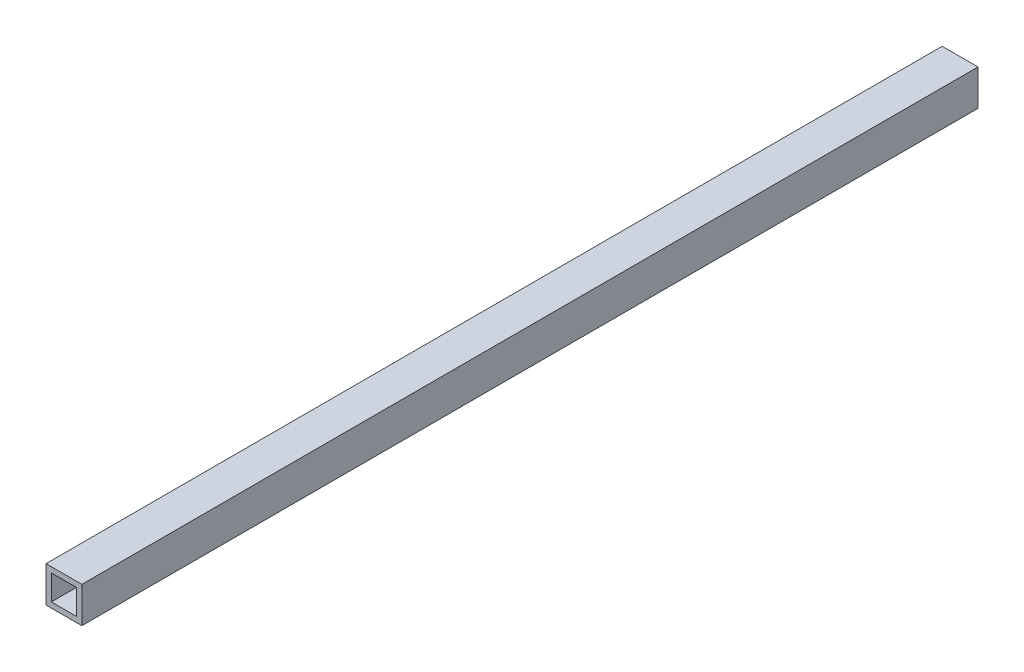
ISO-10303-21;
HEADER;
FILE_DESCRIPTION(('STEP AP214'),'2;1');
FILE_NAME('part.step','',(''),(''),'','','');
FILE_SCHEMA(('AUTOMOTIVE_DESIGN { 1 0 10303 214 1 1 1 1 }'));
ENDSEC;
DATA;
#1=APPLICATION_CONTEXT('core data for automotive mechanical design processes');
#2=APPLICATION_PROTOCOL_DEFINITION('international standard','automotive_design',2000,#1);
#3=PRODUCT_CONTEXT('',#1,'mechanical');
#4=PRODUCT('Part','Part','',(#3));
#5=PRODUCT_RELATED_PRODUCT_CATEGORY('part','',(#4));
#6=PRODUCT_DEFINITION_FORMATION('','',#4);
#7=PRODUCT_DEFINITION_CONTEXT('part definition',#1,'design');
#8=PRODUCT_DEFINITION('design','',#6,#7);
#9=PRODUCT_DEFINITION_SHAPE('','',#8);
#10=(LENGTH_UNIT() NAMED_UNIT(*) SI_UNIT(.MILLI.,.METRE.));
#11=(NAMED_UNIT(*) PLANE_ANGLE_UNIT() SI_UNIT($,.RADIAN.));
#12=(NAMED_UNIT(*) SI_UNIT($,.STERADIAN.) SOLID_ANGLE_UNIT());
#13=UNCERTAINTY_MEASURE_WITH_UNIT(LENGTH_MEASURE(1.E-05),#10,'distance_accuracy_value','');
#14=(GEOMETRIC_REPRESENTATION_CONTEXT(3) GLOBAL_UNCERTAINTY_ASSIGNED_CONTEXT((#13)) GLOBAL_UNIT_ASSIGNED_CONTEXT((#10,
#11,#12)) REPRESENTATION_CONTEXT('',''));
#15=CARTESIAN_POINT('',(0.,0.,0.));
#16=DIRECTION('',(0.,0.,1.));
#17=DIRECTION('',(1.,0.,0.));
#18=AXIS2_PLACEMENT_3D('',#15,#16,#17);
#19=CARTESIAN_POINT('',(0.,0.,250.));
#20=DIRECTION('',(0.,0.,1.));
#21=DIRECTION('',(1.,0.,0.));
#22=AXIS2_PLACEMENT_3D('',#19,#20,#21);
#23=PLANE('',#22);
#24=DIRECTION('',(0.,1.,0.));
#25=VECTOR('',#24,1.);
#26=CARTESIAN_POINT('',(5.,5.,250.));
#27=LINE('',#26,#25);
#28=CARTESIAN_POINT('',(5.,-5.,250.));
#29=VERTEX_POINT('',#28);
#30=CARTESIAN_POINT('',(5.,5.,250.));
#31=VERTEX_POINT('',#30);
#32=EDGE_CURVE('E136',#29,#31,#27,.T.);
#33=ORIENTED_EDGE('',*,*,#32,.T.);
#34=DIRECTION('',(-1.,0.,0.));
#35=VECTOR('',#34,1.);
#36=CARTESIAN_POINT('',(-5.,5.,250.));
#37=LINE('',#36,#35);
#38=CARTESIAN_POINT('',(-5.,5.,250.));
#39=VERTEX_POINT('',#38);
#40=EDGE_CURVE('E139',#31,#39,#37,.T.);
#41=ORIENTED_EDGE('',*,*,#40,.T.);
#42=DIRECTION('',(0.,-1.,0.));
#43=VECTOR('',#42,1.);
#44=CARTESIAN_POINT('',(-5.,5.,250.));
#45=LINE('',#44,#43);
#46=CARTESIAN_POINT('',(-5.,-5.,250.));
#47=VERTEX_POINT('',#46);
#48=EDGE_CURVE('E142',#39,#47,#45,.T.);
#49=ORIENTED_EDGE('',*,*,#48,.T.);
#50=DIRECTION('',(1.,0.,0.));
#51=VECTOR('',#50,1.);
#52=CARTESIAN_POINT('',(-5.,-5.,250.));
#53=LINE('',#52,#51);
#54=EDGE_CURVE('E144',#47,#29,#53,.T.);
#55=ORIENTED_EDGE('',*,*,#54,.T.);
#56=EDGE_LOOP('',(#33,#41,#49,#55));
#57=FACE_BOUND('',#56,.T.);
#58=DIRECTION('',(0.,-1.,0.));
#59=VECTOR('',#58,1.);
#60=CARTESIAN_POINT('',(-3.5,3.5,250.));
#61=LINE('',#60,#59);
#62=CARTESIAN_POINT('',(-3.5,3.5,250.));
#63=VERTEX_POINT('',#62);
#64=CARTESIAN_POINT('',(-3.5,-3.5,250.));
#65=VERTEX_POINT('',#64);
#66=EDGE_CURVE('E108',#63,#65,#61,.T.);
#67=ORIENTED_EDGE('',*,*,#66,.F.);
#68=DIRECTION('',(-1.,0.,0.));
#69=VECTOR('',#68,1.);
#70=CARTESIAN_POINT('',(-3.5,3.5,250.));
#71=LINE('',#70,#69);
#72=CARTESIAN_POINT('',(3.5,3.5,250.));
#73=VERTEX_POINT('',#72);
#74=EDGE_CURVE('E100',#73,#63,#71,.T.);
#75=ORIENTED_EDGE('',*,*,#74,.F.);
#76=DIRECTION('',(0.,1.,0.));
#77=VECTOR('',#76,1.);
#78=CARTESIAN_POINT('',(3.5,3.5,250.));
#79=LINE('',#78,#77);
#80=CARTESIAN_POINT('',(3.5,-3.5,250.));
#81=VERTEX_POINT('',#80);
#82=EDGE_CURVE('E122',#81,#73,#79,.T.);
#83=ORIENTED_EDGE('',*,*,#82,.F.);
#84=DIRECTION('',(1.,0.,0.));
#85=VECTOR('',#84,1.);
#86=CARTESIAN_POINT('',(-3.5,-3.5,250.));
#87=LINE('',#86,#85);
#88=EDGE_CURVE('E120',#65,#81,#87,.T.);
#89=ORIENTED_EDGE('',*,*,#88,.F.);
#90=EDGE_LOOP('',(#67,#75,#83,#89));
#91=FACE_BOUND('',#90,.T.);
#92=ADVANCED_FACE('F35',(#57,#91),#23,.T.);
#93=CARTESIAN_POINT('',(0.,0.,0.));
#94=DIRECTION('',(0.,0.,1.));
#95=DIRECTION('',(1.,0.,0.));
#96=AXIS2_PLACEMENT_3D('',#93,#94,#95);
#97=PLANE('',#96);
#98=DIRECTION('',(0.,1.,0.));
#99=VECTOR('',#98,1.);
#100=CARTESIAN_POINT('',(5.,5.,0.));
#101=LINE('',#100,#99);
#102=CARTESIAN_POINT('',(5.,-5.,0.));
#103=VERTEX_POINT('',#102);
#104=CARTESIAN_POINT('',(5.,5.,0.));
#105=VERTEX_POINT('',#104);
#106=EDGE_CURVE('E116',#103,#105,#101,.T.);
#107=ORIENTED_EDGE('',*,*,#106,.F.);
#108=DIRECTION('',(1.,0.,0.));
#109=VECTOR('',#108,1.);
#110=CARTESIAN_POINT('',(-5.,-5.,0.));
#111=LINE('',#110,#109);
#112=CARTESIAN_POINT('',(-5.,-5.,0.));
#113=VERTEX_POINT('',#112);
#114=EDGE_CURVE('E140',#113,#103,#111,.T.);
#115=ORIENTED_EDGE('',*,*,#114,.F.);
#116=DIRECTION('',(0.,-1.,0.));
#117=VECTOR('',#116,1.);
#118=CARTESIAN_POINT('',(-5.,5.,0.));
#119=LINE('',#118,#117);
#120=CARTESIAN_POINT('',(-5.,5.,0.));
#121=VERTEX_POINT('',#120);
#122=EDGE_CURVE('E151',#121,#113,#119,.T.);
#123=ORIENTED_EDGE('',*,*,#122,.F.);
#124=DIRECTION('',(-1.,0.,0.));
#125=VECTOR('',#124,1.);
#126=CARTESIAN_POINT('',(-5.,5.,0.));
#127=LINE('',#126,#125);
#128=EDGE_CURVE('E149',#105,#121,#127,.T.);
#129=ORIENTED_EDGE('',*,*,#128,.F.);
#130=EDGE_LOOP('',(#107,#115,#123,#129));
#131=FACE_BOUND('',#130,.T.);
#132=DIRECTION('',(-1.,0.,0.));
#133=VECTOR('',#132,1.);
#134=CARTESIAN_POINT('',(-3.5,3.5,0.));
#135=LINE('',#134,#133);
#136=CARTESIAN_POINT('',(3.5,3.5,0.));
#137=VERTEX_POINT('',#136);
#138=CARTESIAN_POINT('',(-3.5,3.5,0.));
#139=VERTEX_POINT('',#138);
#140=EDGE_CURVE('E58',#137,#139,#135,.T.);
#141=ORIENTED_EDGE('',*,*,#140,.T.);
#142=DIRECTION('',(0.,-1.,0.));
#143=VECTOR('',#142,1.);
#144=CARTESIAN_POINT('',(-3.5,3.5,0.));
#145=LINE('',#144,#143);
#146=CARTESIAN_POINT('',(-3.5,-3.5,0.));
#147=VERTEX_POINT('',#146);
#148=EDGE_CURVE('E115',#139,#147,#145,.T.);
#149=ORIENTED_EDGE('',*,*,#148,.T.);
#150=DIRECTION('',(1.,0.,0.));
#151=VECTOR('',#150,1.);
#152=CARTESIAN_POINT('',(-3.5,-3.5,0.));
#153=LINE('',#152,#151);
#154=CARTESIAN_POINT('',(3.5,-3.5,0.));
#155=VERTEX_POINT('',#154);
#156=EDGE_CURVE('E128',#147,#155,#153,.T.);
#157=ORIENTED_EDGE('',*,*,#156,.T.);
#158=DIRECTION('',(0.,1.,0.));
#159=VECTOR('',#158,1.);
#160=CARTESIAN_POINT('',(3.5,3.5,0.));
#161=LINE('',#160,#159);
#162=EDGE_CURVE('E109',#155,#137,#161,.T.);
#163=ORIENTED_EDGE('',*,*,#162,.T.);
#164=EDGE_LOOP('',(#141,#149,#157,#163));
#165=FACE_BOUND('',#164,.T.);
#166=ADVANCED_FACE('F169',(#131,#165),#97,.F.);
#167=CARTESIAN_POINT('',(5.,5.,250.));
#168=DIRECTION('',(-1.,0.,0.));
#169=DIRECTION('',(0.,0.,1.));
#170=AXIS2_PLACEMENT_3D('',#167,#168,#169);
#171=PLANE('',#170);
#172=ORIENTED_EDGE('',*,*,#106,.T.);
#173=DIRECTION('',(0.,0.,-1.));
#174=VECTOR('',#173,1.);
#175=CARTESIAN_POINT('',(5.,5.,250.));
#176=LINE('',#175,#174);
#177=EDGE_CURVE('E11',#31,#105,#176,.T.);
#178=ORIENTED_EDGE('',*,*,#177,.F.);
#179=ORIENTED_EDGE('',*,*,#32,.F.);
#180=DIRECTION('',(0.,0.,-1.));
#181=VECTOR('',#180,1.);
#182=CARTESIAN_POINT('',(5.,-5.,250.));
#183=LINE('',#182,#181);
#184=EDGE_CURVE('E146',#29,#103,#183,.T.);
#185=ORIENTED_EDGE('',*,*,#184,.T.);
#186=EDGE_LOOP('',(#172,#178,#179,#185));
#187=FACE_BOUND('',#186,.T.);
#188=ADVANCED_FACE('F37',(#187),#171,.F.);
#189=CARTESIAN_POINT('',(-5.,5.,250.));
#190=DIRECTION('',(0.,-1.,0.));
#191=DIRECTION('',(0.,0.,-1.));
#192=AXIS2_PLACEMENT_3D('',#189,#190,#191);
#193=PLANE('',#192);
#194=ORIENTED_EDGE('',*,*,#128,.T.);
#195=DIRECTION('',(0.,0.,-1.));
#196=VECTOR('',#195,1.);
#197=CARTESIAN_POINT('',(-5.,5.,250.));
#198=LINE('',#197,#196);
#199=EDGE_CURVE('E43',#39,#121,#198,.T.);
#200=ORIENTED_EDGE('',*,*,#199,.F.);
#201=ORIENTED_EDGE('',*,*,#40,.F.);
#202=ORIENTED_EDGE('',*,*,#177,.T.);
#203=EDGE_LOOP('',(#194,#200,#201,#202));
#204=FACE_BOUND('',#203,.T.);
#205=ADVANCED_FACE('F179',(#204),#193,.F.);
#206=CARTESIAN_POINT('',(-5.,5.,250.));
#207=DIRECTION('',(1.,0.,0.));
#208=DIRECTION('',(0.,0.,-1.));
#209=AXIS2_PLACEMENT_3D('',#206,#207,#208);
#210=PLANE('',#209);
#211=ORIENTED_EDGE('',*,*,#122,.T.);
#212=DIRECTION('',(0.,0.,-1.));
#213=VECTOR('',#212,1.);
#214=CARTESIAN_POINT('',(-5.,-5.,250.));
#215=LINE('',#214,#213);
#216=EDGE_CURVE('E156',#47,#113,#215,.T.);
#217=ORIENTED_EDGE('',*,*,#216,.F.);
#218=ORIENTED_EDGE('',*,*,#48,.F.);
#219=ORIENTED_EDGE('',*,*,#199,.T.);
#220=EDGE_LOOP('',(#211,#217,#218,#219));
#221=FACE_BOUND('',#220,.T.);
#222=ADVANCED_FACE('F163',(#221),#210,.F.);
#223=CARTESIAN_POINT('',(-5.,-5.,250.));
#224=DIRECTION('',(0.,1.,0.));
#225=DIRECTION('',(0.,0.,1.));
#226=AXIS2_PLACEMENT_3D('',#223,#224,#225);
#227=PLANE('',#226);
#228=ORIENTED_EDGE('',*,*,#114,.T.);
#229=ORIENTED_EDGE('',*,*,#184,.F.);
#230=ORIENTED_EDGE('',*,*,#54,.F.);
#231=ORIENTED_EDGE('',*,*,#216,.T.);
#232=EDGE_LOOP('',(#228,#229,#230,#231));
#233=FACE_BOUND('',#232,.T.);
#234=ADVANCED_FACE('F173',(#233),#227,.F.);
#235=CARTESIAN_POINT('',(-3.5,3.5,250.));
#236=DIRECTION('',(0.,-1.,0.));
#237=DIRECTION('',(0.,0.,-1.));
#238=AXIS2_PLACEMENT_3D('',#235,#236,#237);
#239=PLANE('',#238);
#240=ORIENTED_EDGE('',*,*,#140,.F.);
#241=DIRECTION('',(0.,0.,-1.));
#242=VECTOR('',#241,1.);
#243=CARTESIAN_POINT('',(3.5,3.5,250.));
#244=LINE('',#243,#242);
#245=EDGE_CURVE('E104',#73,#137,#244,.T.);
#246=ORIENTED_EDGE('',*,*,#245,.F.);
#247=ORIENTED_EDGE('',*,*,#74,.T.);
#248=DIRECTION('',(0.,0.,-1.));
#249=VECTOR('',#248,1.);
#250=CARTESIAN_POINT('',(-3.5,3.5,250.));
#251=LINE('',#250,#249);
#252=EDGE_CURVE('E103',#63,#139,#251,.T.);
#253=ORIENTED_EDGE('',*,*,#252,.T.);
#254=EDGE_LOOP('',(#240,#246,#247,#253));
#255=FACE_BOUND('',#254,.T.);
#256=ADVANCED_FACE('F102',(#255),#239,.T.);
#257=CARTESIAN_POINT('',(-3.5,3.5,250.));
#258=DIRECTION('',(1.,0.,0.));
#259=DIRECTION('',(0.,0.,-1.));
#260=AXIS2_PLACEMENT_3D('',#257,#258,#259);
#261=PLANE('',#260);
#262=ORIENTED_EDGE('',*,*,#148,.F.);
#263=ORIENTED_EDGE('',*,*,#252,.F.);
#264=ORIENTED_EDGE('',*,*,#66,.T.);
#265=DIRECTION('',(0.,0.,-1.));
#266=VECTOR('',#265,1.);
#267=CARTESIAN_POINT('',(-3.5,-3.5,250.));
#268=LINE('',#267,#266);
#269=EDGE_CURVE('E117',#65,#147,#268,.T.);
#270=ORIENTED_EDGE('',*,*,#269,.T.);
#271=EDGE_LOOP('',(#262,#263,#264,#270));
#272=FACE_BOUND('',#271,.T.);
#273=ADVANCED_FACE('F112',(#272),#261,.T.);
#274=CARTESIAN_POINT('',(-3.5,-3.5,250.));
#275=DIRECTION('',(0.,1.,0.));
#276=DIRECTION('',(-1.,0.,0.));
#277=AXIS2_PLACEMENT_3D('',#274,#275,#276);
#278=PLANE('',#277);
#279=ORIENTED_EDGE('',*,*,#156,.F.);
#280=ORIENTED_EDGE('',*,*,#269,.F.);
#281=ORIENTED_EDGE('',*,*,#88,.T.);
#282=DIRECTION('',(0.,0.,-1.));
#283=VECTOR('',#282,1.);
#284=CARTESIAN_POINT('',(3.5,-3.5,250.));
#285=LINE('',#284,#283);
#286=EDGE_CURVE('E50',#81,#155,#285,.T.);
#287=ORIENTED_EDGE('',*,*,#286,.T.);
#288=EDGE_LOOP('',(#279,#280,#281,#287));
#289=FACE_BOUND('',#288,.T.);
#290=ADVANCED_FACE('F202',(#289),#278,.T.);
#291=CARTESIAN_POINT('',(3.5,3.5,250.));
#292=DIRECTION('',(-1.,0.,0.));
#293=DIRECTION('',(0.,-1.,0.));
#294=AXIS2_PLACEMENT_3D('',#291,#292,#293);
#295=PLANE('',#294);
#296=ORIENTED_EDGE('',*,*,#162,.F.);
#297=ORIENTED_EDGE('',*,*,#286,.F.);
#298=ORIENTED_EDGE('',*,*,#82,.T.);
#299=ORIENTED_EDGE('',*,*,#245,.T.);
#300=EDGE_LOOP('',(#296,#297,#298,#299));
#301=FACE_BOUND('',#300,.T.);
#302=ADVANCED_FACE('F206',(#301),#295,.T.);
#303=CLOSED_SHELL('',(#92,#166,#188,#205,#222,#234,#256,#273,#290,#302));
#304=MANIFOLD_SOLID_BREP('B2',#303);
#305=ADVANCED_BREP_SHAPE_REPRESENTATION('',(#18,#304),#14);
#306=SHAPE_DEFINITION_REPRESENTATION(#9,#305);
ENDSEC;
END-ISO-10303-21;
